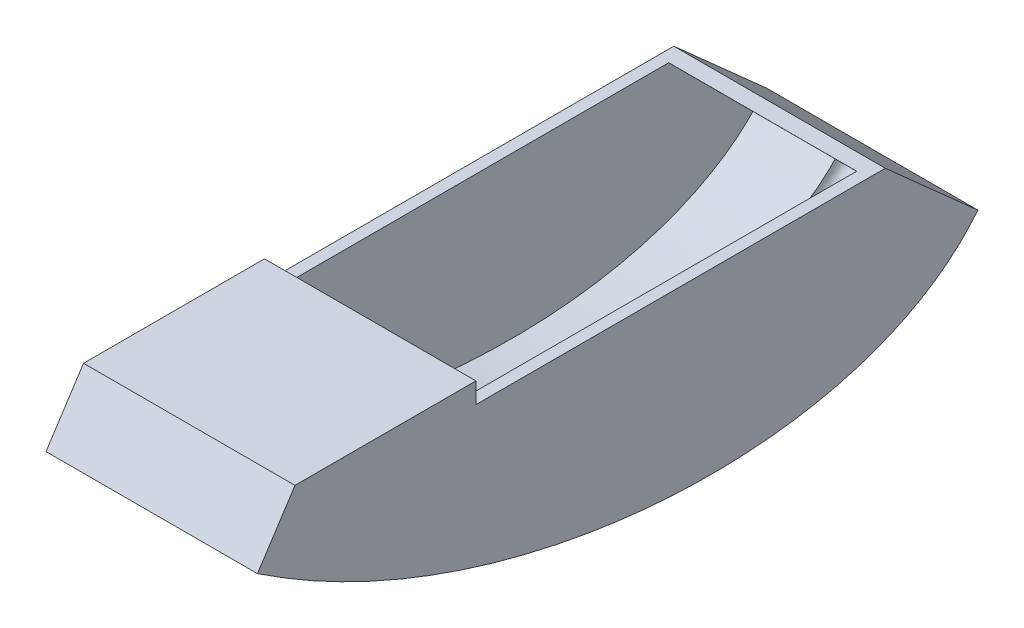
ISO-10303-21;
HEADER;
FILE_DESCRIPTION(('STEP AP214'),'2;1');
FILE_NAME('part.step','',(''),(''),'','','');
FILE_SCHEMA(('AUTOMOTIVE_DESIGN { 1 0 10303 214 1 1 1 1 }'));
ENDSEC;
DATA;
#1=APPLICATION_CONTEXT('core data for automotive mechanical design processes');
#2=APPLICATION_PROTOCOL_DEFINITION('international standard','automotive_design',2000,#1);
#3=PRODUCT_CONTEXT('',#1,'mechanical');
#4=PRODUCT('Part','Part','',(#3));
#5=PRODUCT_RELATED_PRODUCT_CATEGORY('part','',(#4));
#6=PRODUCT_DEFINITION_FORMATION('','',#4);
#7=PRODUCT_DEFINITION_CONTEXT('part definition',#1,'design');
#8=PRODUCT_DEFINITION('design','',#6,#7);
#9=PRODUCT_DEFINITION_SHAPE('','',#8);
#10=(LENGTH_UNIT() NAMED_UNIT(*) SI_UNIT(.MILLI.,.METRE.));
#11=(NAMED_UNIT(*) PLANE_ANGLE_UNIT() SI_UNIT($,.RADIAN.));
#12=(NAMED_UNIT(*) SI_UNIT($,.STERADIAN.) SOLID_ANGLE_UNIT());
#13=UNCERTAINTY_MEASURE_WITH_UNIT(LENGTH_MEASURE(1.E-05),#10,'distance_accuracy_value','');
#14=(GEOMETRIC_REPRESENTATION_CONTEXT(3) GLOBAL_UNCERTAINTY_ASSIGNED_CONTEXT((#13)) GLOBAL_UNIT_ASSIGNED_CONTEXT((#10,
#11,#12)) REPRESENTATION_CONTEXT('',''));
#15=CARTESIAN_POINT('',(0.,0.,0.));
#16=DIRECTION('',(0.,0.,1.));
#17=DIRECTION('',(1.,0.,0.));
#18=AXIS2_PLACEMENT_3D('',#15,#16,#17);
#19=CARTESIAN_POINT('',(-9.,-35.,0.));
#20=DIRECTION('',(0.,1.,0.));
#21=DIRECTION('',(0.,0.,1.));
#22=AXIS2_PLACEMENT_3D('',#19,#20,#21);
#23=PLANE('',#22);
#24=DIRECTION('',(0.,0.,-1.));
#25=VECTOR('',#24,1.);
#26=CARTESIAN_POINT('',(-16.,-35.,0.));
#27=LINE('',#26,#25);
#28=CARTESIAN_POINT('',(-16.,-35.,64.7209914306465));
#29=VERTEX_POINT('',#28);
#30=CARTESIAN_POINT('',(-16.,-35.,35.));
#31=VERTEX_POINT('',#30);
#32=EDGE_CURVE('E323',#29,#31,#27,.T.);
#33=ORIENTED_EDGE('',*,*,#32,.T.);
#34=DIRECTION('',(-1.,0.,0.));
#35=VECTOR('',#34,1.);
#36=CARTESIAN_POINT('',(-9.,-35.,35.));
#37=LINE('',#36,#35);
#38=CARTESIAN_POINT('',(16.,-35.,35.));
#39=VERTEX_POINT('',#38);
#40=EDGE_CURVE('E344',#39,#31,#37,.T.);
#41=ORIENTED_EDGE('',*,*,#40,.F.);
#42=DIRECTION('',(0.,0.,-1.));
#43=VECTOR('',#42,1.);
#44=CARTESIAN_POINT('',(16.,-35.,0.));
#45=LINE('',#44,#43);
#46=CARTESIAN_POINT('',(16.,-35.,64.7209914306465));
#47=VERTEX_POINT('',#46);
#48=EDGE_CURVE('E43',#47,#39,#45,.T.);
#49=ORIENTED_EDGE('',*,*,#48,.F.);
#50=DIRECTION('',(-1.,0.,0.));
#51=VECTOR('',#50,1.);
#52=CARTESIAN_POINT('',(-9.,-35.,64.7209914306465));
#53=LINE('',#52,#51);
#54=EDGE_CURVE('E305',#47,#29,#53,.T.);
#55=ORIENTED_EDGE('',*,*,#54,.T.);
#56=EDGE_LOOP('',(#33,#41,#49,#55));
#57=FACE_BOUND('',#56,.T.);
#58=ADVANCED_FACE('F39',(#57),#23,.F.);
#59=CARTESIAN_POINT('',(-9.,-19.3314120464027,-50.));
#60=DIRECTION('',(-1.,0.,0.));
#61=DIRECTION('',(0.,0.,1.));
#62=AXIS2_PLACEMENT_3D('',#59,#60,#61);
#63=CYLINDRICAL_SURFACE('',#62,25.);
#64=CARTESIAN_POINT('',(-16.,-19.3314120464027,-50.));
#65=DIRECTION('',(1.,0.,0.));
#66=DIRECTION('',(0.,0.,-1.));
#67=AXIS2_PLACEMENT_3D('',#64,#65,#66);
#68=CIRCLE('',#67,25.);
#69=CARTESIAN_POINT('',(-16.,-37.9942487774482,-33.3657424226286));
#70=VERTEX_POINT('',#69);
#71=CARTESIAN_POINT('',(-16.,-36.5012218389645,-31.828659056436));
#72=VERTEX_POINT('',#71);
#73=EDGE_CURVE('E321',#70,#72,#68,.F.);
#74=ORIENTED_EDGE('',*,*,#73,.F.);
#75=DIRECTION('',(-1.,0.,0.));
#76=VECTOR('',#75,1.);
#77=CARTESIAN_POINT('',(-9.,-37.9942487774482,-33.3657424226286));
#78=LINE('',#77,#76);
#79=CARTESIAN_POINT('',(16.,-37.9942487774482,-33.3657424226286));
#80=VERTEX_POINT('',#79);
#81=EDGE_CURVE('E318',#80,#70,#78,.T.);
#82=ORIENTED_EDGE('',*,*,#81,.F.);
#83=CARTESIAN_POINT('',(16.,-19.3314120464027,-50.));
#84=DIRECTION('',(1.,0.,0.));
#85=DIRECTION('',(0.,0.,-1.));
#86=AXIS2_PLACEMENT_3D('',#83,#84,#85);
#87=CIRCLE('',#86,25.);
#88=CARTESIAN_POINT('',(16.,-36.5012218389645,-31.828659056436));
#89=VERTEX_POINT('',#88);
#90=EDGE_CURVE('E325',#80,#89,#87,.F.);
#91=ORIENTED_EDGE('',*,*,#90,.T.);
#92=DIRECTION('',(-1.,0.,0.));
#93=VECTOR('',#92,1.);
#94=CARTESIAN_POINT('',(-9.,-36.5012218389645,-31.828659056436));
#95=LINE('',#94,#93);
#96=EDGE_CURVE('E99',#72,#89,#95,.F.);
#97=ORIENTED_EDGE('',*,*,#96,.F.);
#98=EDGE_LOOP('',(#74,#82,#91,#97));
#99=FACE_BOUND('',#98,.T.);
#100=ADVANCED_FACE('F41',(#99),#63,.T.);
#101=CARTESIAN_POINT('',(-16.,-48.7371623119089,-45.4187745688977));
#102=DIRECTION('',(1.,0.,0.));
#103=DIRECTION('',(0.,0.,-1.));
#104=AXIS2_PLACEMENT_3D('',#101,#102,#103);
#105=PLANE('',#104);
#106=DIRECTION('',(0.,0.,-1.));
#107=VECTOR('',#106,1.);
#108=CARTESIAN_POINT('',(-16.,-36.5012218389645,-45.4187745688977));
#109=LINE('',#108,#107);
#110=CARTESIAN_POINT('',(-16.,-36.5012218389645,35.));
#111=VERTEX_POINT('',#110);
#112=EDGE_CURVE('E417',#72,#111,#109,.F.);
#113=ORIENTED_EDGE('',*,*,#112,.T.);
#114=DIRECTION('',(0.,-1.,0.));
#115=VECTOR('',#114,1.);
#116=CARTESIAN_POINT('',(-16.,-48.7371623119092,34.9999999999999));
#117=LINE('',#116,#115);
#118=EDGE_CURVE('E89',#111,#31,#117,.F.);
#119=ORIENTED_EDGE('',*,*,#118,.T.);
#120=ORIENTED_EDGE('',*,*,#32,.F.);
#121=DIRECTION('',(0.,-0.838452772621463,0.544974263689012));
#122=VECTOR('',#121,1.);
#123=CARTESIAN_POINT('',(-16.,-39.7245368931714,67.7918274976293));
#124=LINE('',#123,#122);
#125=CARTESIAN_POINT('',(-16.,-41.4014424384143,68.8817760250073));
#126=VERTEX_POINT('',#125);
#127=EDGE_CURVE('E288',#29,#126,#124,.T.);
#128=ORIENTED_EDGE('',*,*,#127,.T.);
#129=CARTESIAN_POINT('',(-16.,-50.0679029180986,-46.9118015073813));
#130=CARTESIAN_POINT('',(-16.,-52.7594721746176,-44.5127955594893));
#131=CARTESIAN_POINT('',(-16.,-55.0306081242549,-41.5208673054452));
#132=CARTESIAN_POINT('',(-16.,-58.7801313824813,-34.6145473661733));
#133=CARTESIAN_POINT('',(-16.,-60.2599521903167,-30.6988687341364));
#134=CARTESIAN_POINT('',(-16.,-63.5749687861851,-17.8677454230769));
#135=CARTESIAN_POINT('',(-16.,-64.2909028498268,-7.86297639115742));
#136=CARTESIAN_POINT('',(-16.,-62.8066662150088,13.5188430697771));
#137=CARTESIAN_POINT('',(-16.,-60.6015112851942,24.8955807312422));
#138=CARTESIAN_POINT('',(-16.,-53.2352700502261,47.4444471127434));
#139=CARTESIAN_POINT('',(-16.,-48.0737268684886,58.6163456127337));
#140=CARTESIAN_POINT('',(-16.,-41.4014424384143,68.8817760250073));
#141=B_SPLINE_CURVE_WITH_KNOTS('',3,(#129,#130,#131,#132,#133,#134,#135,#136,#137,#138,#139,
#140),.UNSPECIFIED.,.F.,.F.,(4,2,2,2,2,4),(0.,0.125,0.25,0.5,0.75,1.),.UNSPECIFIED.);
#142=CARTESIAN_POINT('',(-16.,-50.0679029180986,-46.9118015073813));
#143=VERTEX_POINT('',#142);
#144=EDGE_CURVE('E272',#143,#126,#141,.T.);
#145=ORIENTED_EDGE('',*,*,#144,.F.);
#146=DIRECTION('',(0.,-0.665370303094855,-0.746513469241822));
#147=VECTOR('',#146,1.);
#148=CARTESIAN_POINT('',(-16.,-48.7371623119089,-45.4187745688977));
#149=LINE('',#148,#147);
#150=EDGE_CURVE('E284',#70,#143,#149,.T.);
#151=ORIENTED_EDGE('',*,*,#150,.F.);
#152=ORIENTED_EDGE('',*,*,#73,.T.);
#153=EDGE_LOOP('',(#113,#119,#120,#128,#145,#151,#152));
#154=FACE_BOUND('',#153,.T.);
#155=ADVANCED_FACE('F255',(#154),#105,.T.);
#156=CARTESIAN_POINT('',(16.,-50.0679029180986,-46.9118015073813));
#157=DIRECTION('',(1.,0.,0.));
#158=DIRECTION('',(0.,0.,-1.));
#159=AXIS2_PLACEMENT_3D('',#156,#157,#158);
#160=PLANE('',#159);
#161=DIRECTION('',(0.,0.,-1.));
#162=VECTOR('',#161,1.);
#163=CARTESIAN_POINT('',(16.,-36.5012218389645,-46.9118015073813));
#164=LINE('',#163,#162);
#165=CARTESIAN_POINT('',(16.,-36.5012218389645,35.));
#166=VERTEX_POINT('',#165);
#167=EDGE_CURVE('E414',#166,#89,#164,.T.);
#168=ORIENTED_EDGE('',*,*,#167,.T.);
#169=ORIENTED_EDGE('',*,*,#90,.F.);
#170=DIRECTION('',(0.,0.665370303094854,0.746513469241823));
#171=VECTOR('',#170,1.);
#172=CARTESIAN_POINT('',(16.,-50.0679029180986,-46.9118015073813));
#173=LINE('',#172,#171);
#174=CARTESIAN_POINT('',(16.,-50.0679029180986,-46.9118015073813));
#175=VERTEX_POINT('',#174);
#176=EDGE_CURVE('E373',#175,#80,#173,.T.);
#177=ORIENTED_EDGE('',*,*,#176,.F.);
#178=CARTESIAN_POINT('',(16.,-41.4014424384143,68.8817760250073));
#179=CARTESIAN_POINT('',(16.,-48.0737268684886,58.6163456127337));
#180=CARTESIAN_POINT('',(16.,-53.2352700502261,47.4444471127434));
#181=CARTESIAN_POINT('',(16.,-60.6015112851942,24.8955807312422));
#182=CARTESIAN_POINT('',(16.,-62.8066662150088,13.5188430697771));
#183=CARTESIAN_POINT('',(16.,-64.2909028498268,-7.86297639115742));
#184=CARTESIAN_POINT('',(16.,-63.5749687861851,-17.8677454230769));
#185=CARTESIAN_POINT('',(16.,-60.2599521903167,-30.6988687341364));
#186=CARTESIAN_POINT('',(16.,-58.7801313824813,-34.6145473661733));
#187=CARTESIAN_POINT('',(16.,-55.0306081242549,-41.5208673054452));
#188=CARTESIAN_POINT('',(16.,-52.7594721746176,-44.5127955594893));
#189=CARTESIAN_POINT('',(16.,-50.0679029180986,-46.9118015073813));
#190=B_SPLINE_CURVE_WITH_KNOTS('',3,(#178,#179,#180,#181,#182,#183,#184,#185,#186,#187,#188,
#189),.UNSPECIFIED.,.F.,.F.,(4,2,2,2,2,4),(0.,0.25,0.5,0.75,0.875,1.),.UNSPECIFIED.);
#191=CARTESIAN_POINT('',(16.,-41.4014424384143,68.8817760250073));
#192=VERTEX_POINT('',#191);
#193=EDGE_CURVE('E226',#175,#192,#190,.F.);
#194=ORIENTED_EDGE('',*,*,#193,.T.);
#195=DIRECTION('',(0.,0.838452772621465,-0.54497426368901));
#196=VECTOR('',#195,1.);
#197=CARTESIAN_POINT('',(16.,-41.4014424384143,68.8817760250073));
#198=LINE('',#197,#196);
#199=EDGE_CURVE('E339',#192,#47,#198,.T.);
#200=ORIENTED_EDGE('',*,*,#199,.T.);
#201=ORIENTED_EDGE('',*,*,#48,.T.);
#202=DIRECTION('',(0.,-1.,0.));
#203=VECTOR('',#202,1.);
#204=CARTESIAN_POINT('',(16.,-50.0679029180989,34.9999999999999));
#205=LINE('',#204,#203);
#206=EDGE_CURVE('E336',#39,#166,#205,.T.);
#207=ORIENTED_EDGE('',*,*,#206,.T.);
#208=EDGE_LOOP('',(#168,#169,#177,#194,#200,#201,#207));
#209=FACE_BOUND('',#208,.T.);
#210=ADVANCED_FACE('F188',(#209),#160,.F.);
#211=CARTESIAN_POINT('',(0.,-50.0679029180986,-46.9118015073813));
#212=DIRECTION('',(0.,-0.74651346924182,0.665370303094858));
#213=DIRECTION('',(0.,-0.665370303094858,-0.74651346924182));
#214=AXIS2_PLACEMENT_3D('',#211,#212,#213);
#215=PLANE('',#214);
#216=ORIENTED_EDGE('',*,*,#150,.T.);
#217=DIRECTION('',(1.,0.,0.));
#218=VECTOR('',#217,1.);
#219=CARTESIAN_POINT('',(-16.,-50.0679029180986,-46.9118015073813));
#220=LINE('',#219,#218);
#221=CARTESIAN_POINT('',(-2.,-50.0679029180986,-46.9118015073813));
#222=VERTEX_POINT('',#221);
#223=EDGE_CURVE('E296',#143,#222,#220,.T.);
#224=ORIENTED_EDGE('',*,*,#223,.T.);
#225=CARTESIAN_POINT('',(0.,-50.0679029180986,-46.9118015073813));
#226=DIRECTION('',(0.,-0.74651346924182,0.665370303094858));
#227=DIRECTION('',(0.,-0.665370303094858,-0.74651346924182));
#228=AXIS2_PLACEMENT_3D('',#225,#226,#227);
#229=CIRCLE('',#228,2.);
#230=CARTESIAN_POINT('',(2.,-50.0679029180986,-46.9118015073813));
#231=VERTEX_POINT('',#230);
#232=EDGE_CURVE('E301',#222,#231,#229,.T.);
#233=ORIENTED_EDGE('',*,*,#232,.T.);
#234=DIRECTION('',(1.,0.,0.));
#235=VECTOR('',#234,1.);
#236=CARTESIAN_POINT('',(2.,-50.0679029180986,-46.9118015073813));
#237=LINE('',#236,#235);
#238=EDGE_CURVE('E303',#231,#175,#237,.T.);
#239=ORIENTED_EDGE('',*,*,#238,.T.);
#240=ORIENTED_EDGE('',*,*,#176,.T.);
#241=ORIENTED_EDGE('',*,*,#81,.T.);
#242=EDGE_LOOP('',(#216,#224,#233,#239,#240,#241));
#243=FACE_BOUND('',#242,.T.);
#244=ADVANCED_FACE('F184',(#243),#215,.T.);
#245=CARTESIAN_POINT('',(0.,-41.4014424384143,68.8817760250073));
#246=DIRECTION('',(0.,0.544974263689015,0.838452772621462));
#247=DIRECTION('',(0.,-0.838452772621462,0.544974263689015));
#248=AXIS2_PLACEMENT_3D('',#245,#246,#247);
#249=PLANE('',#248);
#250=ORIENTED_EDGE('',*,*,#127,.F.);
#251=ORIENTED_EDGE('',*,*,#54,.F.);
#252=ORIENTED_EDGE('',*,*,#199,.F.);
#253=DIRECTION('',(1.,0.,0.));
#254=VECTOR('',#253,1.);
#255=CARTESIAN_POINT('',(2.,-41.4014424384143,68.8817760250073));
#256=LINE('',#255,#254);
#257=CARTESIAN_POINT('',(2.,-41.4014424384143,68.8817760250073));
#258=VERTEX_POINT('',#257);
#259=EDGE_CURVE('E365',#258,#192,#256,.T.);
#260=ORIENTED_EDGE('',*,*,#259,.F.);
#261=CARTESIAN_POINT('',(0.,-41.4014424384143,68.8817760250073));
#262=DIRECTION('',(0.,0.544974263689015,0.838452772621462));
#263=DIRECTION('',(0.,-0.838452772621462,0.544974263689015));
#264=AXIS2_PLACEMENT_3D('',#261,#262,#263);
#265=CIRCLE('',#264,2.);
#266=CARTESIAN_POINT('',(-2.,-41.4014424384143,68.8817760250073));
#267=VERTEX_POINT('',#266);
#268=EDGE_CURVE('E388',#267,#258,#265,.T.);
#269=ORIENTED_EDGE('',*,*,#268,.F.);
#270=DIRECTION('',(1.,0.,0.));
#271=VECTOR('',#270,1.);
#272=CARTESIAN_POINT('',(-16.,-41.4014424384143,68.8817760250073));
#273=LINE('',#272,#271);
#274=EDGE_CURVE('E293',#126,#267,#273,.T.);
#275=ORIENTED_EDGE('',*,*,#274,.F.);
#276=EDGE_LOOP('',(#250,#251,#252,#260,#269,#275));
#277=FACE_BOUND('',#276,.T.);
#278=ADVANCED_FACE('F187',(#277),#249,.F.);
#279=CARTESIAN_POINT('',(2.,-50.0679029180986,-46.9118015073813));
#280=CARTESIAN_POINT('',(2.,-52.7594721746176,-44.5127955594893));
#281=CARTESIAN_POINT('',(2.,-55.0306081242549,-41.5208673054452));
#282=CARTESIAN_POINT('',(2.,-58.7801313824813,-34.6145473661733));
#283=CARTESIAN_POINT('',(2.,-60.2599521903167,-30.6988687341364));
#284=CARTESIAN_POINT('',(2.,-63.5749687861851,-17.8677454230769));
#285=CARTESIAN_POINT('',(2.,-64.2909028498268,-7.86297639115742));
#286=CARTESIAN_POINT('',(2.,-62.8066662150088,13.5188430697771));
#287=CARTESIAN_POINT('',(2.,-60.6015112851942,24.8955807312422));
#288=CARTESIAN_POINT('',(2.,-53.2352700502261,47.4444471127434));
#289=CARTESIAN_POINT('',(2.,-48.0737268684886,58.6163456127337));
#290=CARTESIAN_POINT('',(2.,-41.4014424384143,68.8817760250073));
#291=CARTESIAN_POINT('',(16.,-50.0679029180986,-46.9118015073813));
#292=CARTESIAN_POINT('',(16.,-52.7594721746176,-44.5127955594893));
#293=CARTESIAN_POINT('',(16.,-55.0306081242549,-41.5208673054452));
#294=CARTESIAN_POINT('',(16.,-58.7801313824813,-34.6145473661733));
#295=CARTESIAN_POINT('',(16.,-60.2599521903167,-30.6988687341364));
#296=CARTESIAN_POINT('',(16.,-63.5749687861851,-17.8677454230769));
#297=CARTESIAN_POINT('',(16.,-64.2909028498268,-7.86297639115742));
#298=CARTESIAN_POINT('',(16.,-62.8066662150088,13.5188430697771));
#299=CARTESIAN_POINT('',(16.,-60.6015112851942,24.8955807312422));
#300=CARTESIAN_POINT('',(16.,-53.2352700502261,47.4444471127434));
#301=CARTESIAN_POINT('',(16.,-48.0737268684886,58.6163456127337));
#302=CARTESIAN_POINT('',(16.,-41.4014424384143,68.8817760250073));
#303=B_SPLINE_SURFACE_WITH_KNOTS('',1,3,((#279,#280,#281,#282,#283,#284,#285,#286,#287,#288,
#289,#290),(#291,#292,#293,#294,#295,#296,#297,#298,#299,#300,#301,#302)),.UNSPECIFIED.,.F.,.F.,
.F.,(2,2),(4,2,2,2,2,4),(0.,1.),(0.,0.125,0.25,0.5,0.75,1.),.UNSPECIFIED.);
#304=CARTESIAN_POINT('',(2.,-50.0679029180986,-46.9118015073813));
#305=CARTESIAN_POINT('',(2.,-52.7594721746176,-44.5127955594893));
#306=CARTESIAN_POINT('',(2.,-55.0306081242549,-41.5208673054452));
#307=CARTESIAN_POINT('',(2.,-58.7801313824813,-34.6145473661733));
#308=CARTESIAN_POINT('',(2.,-60.2599521903167,-30.6988687341364));
#309=CARTESIAN_POINT('',(2.,-63.5749687861851,-17.8677454230769));
#310=CARTESIAN_POINT('',(2.,-64.2909028498268,-7.86297639115742));
#311=CARTESIAN_POINT('',(2.,-62.8066662150088,13.5188430697771));
#312=CARTESIAN_POINT('',(2.,-60.6015112851942,24.8955807312422));
#313=CARTESIAN_POINT('',(2.,-53.2352700502261,47.4444471127434));
#314=CARTESIAN_POINT('',(2.,-48.0737268684886,58.6163456127337));
#315=CARTESIAN_POINT('',(2.,-41.4014424384143,68.8817760250073));
#316=(BOUNDED_CURVE() B_SPLINE_CURVE(3,(#304,#305,#306,#307,#308,#309,#310,#311,#312,#313,#314,
#315),.UNSPECIFIED.,.F.,.F.) B_SPLINE_CURVE_WITH_KNOTS((4,2,2,2,2,4),(0.,0.125,0.25,0.5,0.75,
1.),.UNSPECIFIED.) CURVE() GEOMETRIC_REPRESENTATION_ITEM() RATIONAL_B_SPLINE_CURVE((1.,1.,1.,1.,
1.,1.,1.,1.,1.,1.,1.,1.)) REPRESENTATION_ITEM(''));
#317=EDGE_CURVE('E370',#231,#258,#316,.T.);
#318=ORIENTED_EDGE('',*,*,#193,.F.);
#319=ORIENTED_EDGE('',*,*,#238,.F.);
#320=ORIENTED_EDGE('',*,*,#317,.T.);
#321=ORIENTED_EDGE('',*,*,#259,.T.);
#322=EDGE_LOOP('',(#318,#319,#320,#321));
#323=FACE_BOUND('',#322,.T.);
#324=ADVANCED_FACE('F192',(#323),#303,.F.);
#325=CARTESIAN_POINT('',(-16.,-50.0679029180986,-46.9118015073813));
#326=CARTESIAN_POINT('',(-16.,-52.7594721746176,-44.5127955594893));
#327=CARTESIAN_POINT('',(-16.,-55.0306081242549,-41.5208673054452));
#328=CARTESIAN_POINT('',(-16.,-58.7801313824813,-34.6145473661733));
#329=CARTESIAN_POINT('',(-16.,-60.2599521903167,-30.6988687341364));
#330=CARTESIAN_POINT('',(-16.,-63.5749687861851,-17.8677454230769));
#331=CARTESIAN_POINT('',(-16.,-64.2909028498268,-7.86297639115742));
#332=CARTESIAN_POINT('',(-16.,-62.8066662150088,13.5188430697771));
#333=CARTESIAN_POINT('',(-16.,-60.6015112851942,24.8955807312422));
#334=CARTESIAN_POINT('',(-16.,-53.2352700502261,47.4444471127434));
#335=CARTESIAN_POINT('',(-16.,-48.0737268684886,58.6163456127337));
#336=CARTESIAN_POINT('',(-16.,-41.4014424384143,68.8817760250073));
#337=CARTESIAN_POINT('',(-2.,-50.0679029180986,-46.9118015073813));
#338=CARTESIAN_POINT('',(-2.,-52.7594721746176,-44.5127955594893));
#339=CARTESIAN_POINT('',(-2.,-55.0306081242549,-41.5208673054452));
#340=CARTESIAN_POINT('',(-2.,-58.7801313824813,-34.6145473661733));
#341=CARTESIAN_POINT('',(-2.,-60.2599521903167,-30.6988687341364));
#342=CARTESIAN_POINT('',(-2.,-63.5749687861851,-17.8677454230769));
#343=CARTESIAN_POINT('',(-2.,-64.2909028498268,-7.86297639115742));
#344=CARTESIAN_POINT('',(-2.,-62.8066662150088,13.5188430697771));
#345=CARTESIAN_POINT('',(-2.,-60.6015112851942,24.8955807312422));
#346=CARTESIAN_POINT('',(-2.,-53.2352700502261,47.4444471127434));
#347=CARTESIAN_POINT('',(-2.,-48.0737268684886,58.6163456127337));
#348=CARTESIAN_POINT('',(-2.,-41.4014424384143,68.8817760250073));
#349=B_SPLINE_SURFACE_WITH_KNOTS('',1,3,((#325,#326,#327,#328,#329,#330,#331,#332,#333,#334,
#335,#336),(#337,#338,#339,#340,#341,#342,#343,#344,#345,#346,#347,#348)),.UNSPECIFIED.,.F.,.F.,
.F.,(2,2),(4,2,2,2,2,4),(0.,1.),(0.,0.125,0.25,0.5,0.75,1.),.UNSPECIFIED.);
#350=CARTESIAN_POINT('',(-2.,-50.0679029180986,-46.9118015073813));
#351=CARTESIAN_POINT('',(-2.,-52.7594721746176,-44.5127955594893));
#352=CARTESIAN_POINT('',(-2.,-55.0306081242549,-41.5208673054452));
#353=CARTESIAN_POINT('',(-2.,-58.7801313824813,-34.6145473661733));
#354=CARTESIAN_POINT('',(-2.,-60.2599521903167,-30.6988687341364));
#355=CARTESIAN_POINT('',(-2.,-63.5749687861851,-17.8677454230769));
#356=CARTESIAN_POINT('',(-2.,-64.2909028498268,-7.86297639115742));
#357=CARTESIAN_POINT('',(-2.,-62.8066662150088,13.5188430697771));
#358=CARTESIAN_POINT('',(-2.,-60.6015112851942,24.8955807312422));
#359=CARTESIAN_POINT('',(-2.,-53.2352700502261,47.4444471127434));
#360=CARTESIAN_POINT('',(-2.,-48.0737268684886,58.6163456127337));
#361=CARTESIAN_POINT('',(-2.,-41.4014424384143,68.8817760250073));
#362=B_SPLINE_CURVE_WITH_KNOTS('',3,(#350,#351,#352,#353,#354,#355,#356,#357,#358,#359,#360,
#361),.UNSPECIFIED.,.F.,.F.,(4,2,2,2,2,4),(0.,0.125,0.25,0.5,0.75,1.),.UNSPECIFIED.);
#363=EDGE_CURVE('E298',#222,#267,#362,.T.);
#364=ORIENTED_EDGE('',*,*,#363,.F.);
#365=ORIENTED_EDGE('',*,*,#223,.F.);
#366=ORIENTED_EDGE('',*,*,#144,.T.);
#367=ORIENTED_EDGE('',*,*,#274,.T.);
#368=EDGE_LOOP('',(#364,#365,#366,#367));
#369=FACE_BOUND('',#368,.T.);
#370=ADVANCED_FACE('F199',(#369),#349,.F.);
#371=CARTESIAN_POINT('',(-2.,-50.0679029180986,-46.9118015073813));
#372=CARTESIAN_POINT('',(-2.,-52.7594721746176,-44.5127955594893));
#373=CARTESIAN_POINT('',(-2.,-55.0306081242549,-41.5208673054452));
#374=CARTESIAN_POINT('',(-2.,-58.7801313824813,-34.6145473661733));
#375=CARTESIAN_POINT('',(-2.,-60.2599521903167,-30.6988687341364));
#376=CARTESIAN_POINT('',(-2.,-63.5749687861851,-17.8677454230769));
#377=CARTESIAN_POINT('',(-2.,-64.2909028498268,-7.86297639115742));
#378=CARTESIAN_POINT('',(-2.,-62.8066662150088,13.5188430697771));
#379=CARTESIAN_POINT('',(-2.,-60.6015112851942,24.8955807312422));
#380=CARTESIAN_POINT('',(-2.,-53.2352700502261,47.4444471127434));
#381=CARTESIAN_POINT('',(-2.,-48.0737268684886,58.6163456127337));
#382=CARTESIAN_POINT('',(-2.,-41.4014424384143,68.8817760250073));
#383=CARTESIAN_POINT('',(-2.,-52.729384130478,-49.8978553843486));
#384=CARTESIAN_POINT('',(-2.,-55.8231365587786,-47.14038204041));
#385=CARTESIAN_POINT('',(-2.,-58.3615305169903,-43.7690529465912));
#386=CARTESIAN_POINT('',(-2.,-62.4798750270147,-36.1833939586343));
#387=CARTESIAN_POINT('',(-2.,-64.0641260758127,-31.965203225916));
#388=CARTESIAN_POINT('',(-2.,-67.5851249268749,-18.3368037512888));
#389=CARTESIAN_POINT('',(-2.,-68.3056707435307,-7.93705692740055));
#390=CARTESIAN_POINT('',(-2.,-66.7726934712865,14.1469170843479));
#391=CARTESIAN_POINT('',(-2.,-64.5042176881784,25.830205965516));
#392=CARTESIAN_POINT('',(-2.,-56.9370742581048,48.9940558387224));
#393=CARTESIAN_POINT('',(-2.,-51.6370359810741,60.4739261670237));
#394=CARTESIAN_POINT('',(-2.,-44.7552535289001,71.0616730797634));
#395=CARTESIAN_POINT('',(2.,-52.729384130478,-49.8978553843486));
#396=CARTESIAN_POINT('',(2.,-55.8231365587786,-47.14038204041));
#397=CARTESIAN_POINT('',(2.,-58.3615305169903,-43.7690529465912));
#398=CARTESIAN_POINT('',(2.,-62.4798750270147,-36.1833939586343));
#399=CARTESIAN_POINT('',(2.,-64.0641260758127,-31.965203225916));
#400=CARTESIAN_POINT('',(2.,-67.5851249268749,-18.3368037512888));
#401=CARTESIAN_POINT('',(2.,-68.3056707435307,-7.93705692740055));
#402=CARTESIAN_POINT('',(2.,-66.7726934712865,14.1469170843479));
#403=CARTESIAN_POINT('',(2.,-64.5042176881784,25.830205965516));
#404=CARTESIAN_POINT('',(2.,-56.9370742581048,48.9940558387224));
#405=CARTESIAN_POINT('',(2.,-51.6370359810741,60.4739261670237));
#406=CARTESIAN_POINT('',(2.,-44.7552535289001,71.0616730797634));
#407=CARTESIAN_POINT('',(2.,-50.0679029180986,-46.9118015073813));
#408=CARTESIAN_POINT('',(2.,-52.7594721746176,-44.5127955594893));
#409=CARTESIAN_POINT('',(2.,-55.0306081242549,-41.5208673054452));
#410=CARTESIAN_POINT('',(2.,-58.7801313824813,-34.6145473661733));
#411=CARTESIAN_POINT('',(2.,-60.2599521903167,-30.6988687341364));
#412=CARTESIAN_POINT('',(2.,-63.5749687861851,-17.8677454230769));
#413=CARTESIAN_POINT('',(2.,-64.2909028498268,-7.86297639115742));
#414=CARTESIAN_POINT('',(2.,-62.8066662150088,13.5188430697771));
#415=CARTESIAN_POINT('',(2.,-60.6015112851942,24.8955807312422));
#416=CARTESIAN_POINT('',(2.,-53.2352700502261,47.4444471127434));
#417=CARTESIAN_POINT('',(2.,-48.0737268684886,58.6163456127337));
#418=CARTESIAN_POINT('',(2.,-41.4014424384143,68.8817760250073));
#419=(BOUNDED_SURFACE() B_SPLINE_SURFACE(3,3,((#371,#372,#373,#374,#375,#376,#377,#378,#379,
#380,#381,#382),(#383,#384,#385,#386,#387,#388,#389,#390,#391,#392,#393,#394),(#395,#396,#397,
#398,#399,#400,#401,#402,#403,#404,#405,#406),(#407,#408,#409,#410,#411,#412,#413,#414,#415,
#416,#417,#418)),.UNSPECIFIED.,.F.,.F.,.F.) B_SPLINE_SURFACE_WITH_KNOTS((4,4),(4,2,2,2,2,4),(0.,
1.),(0.,0.125,0.25,0.5,0.75,1.),
.UNSPECIFIED.) GEOMETRIC_REPRESENTATION_ITEM() RATIONAL_B_SPLINE_SURFACE(((1.,1.,1.,1.,1.,1.,1.,
1.,1.,1.,1.,1.),(0.333333333333333,0.333333333333333,0.333333333333333,0.333333333333333,
0.333333333333333,0.333333333333333,0.333333333333333,0.333333333333333,0.333333333333333,
0.333333333333333,0.333333333333333,0.333333333333333),(0.333333333333333,0.333333333333333,
0.333333333333333,0.333333333333333,0.333333333333333,0.333333333333333,0.333333333333333,
0.333333333333333,0.333333333333333,0.333333333333333,0.333333333333333,0.333333333333333),(1.,
1.,1.,1.,1.,1.,1.,1.,1.,1.,1.,1.))) REPRESENTATION_ITEM('') SURFACE());
#420=ORIENTED_EDGE('',*,*,#317,.F.);
#421=ORIENTED_EDGE('',*,*,#232,.F.);
#422=ORIENTED_EDGE('',*,*,#363,.T.);
#423=ORIENTED_EDGE('',*,*,#268,.T.);
#424=EDGE_LOOP('',(#420,#421,#422,#423));
#425=FACE_BOUND('',#424,.T.);
#426=ADVANCED_FACE('F169',(#425),#419,.F.);
#427=CARTESIAN_POINT('',(18.,-42.8268522289006,72.1936043613172));
#428=CARTESIAN_POINT('',(18.,-43.2557600418929,71.5337219247264));
#429=CARTESIAN_POINT('',(18.,-44.1052836947944,70.2367414340145));
#430=CARTESIAN_POINT('',(18.,-45.8673203175257,67.4583307716444));
#431=CARTESIAN_POINT('',(18.,-48.7587932581704,62.5936698574761));
#432=CARTESIAN_POINT('',(18.,-52.5251586979627,55.4208917710102));
#433=CARTESIAN_POINT('',(18.,-56.4113352929365,46.6170486633399));
#434=CARTESIAN_POINT('',(18.,-60.775628402668,34.6998176577238));
#435=CARTESIAN_POINT('',(18.,-64.7028397405151,19.6873210429305));
#436=CARTESIAN_POINT('',(18.,-66.9934926757415,2.12397905459888));
#437=CARTESIAN_POINT('',(18.,-66.8859778976843,-11.6125861914613));
#438=CARTESIAN_POINT('',(18.,-65.5643872759321,-21.766099042637));
#439=CARTESIAN_POINT('',(18.,-63.93728287803,-28.8917332558043));
#440=CARTESIAN_POINT('',(18.,-62.031787567841,-34.3622722883523));
#441=CARTESIAN_POINT('',(18.,-60.1547922144173,-38.4181548263212));
#442=CARTESIAN_POINT('',(18.,-58.5653681271417,-41.2862759611761));
#443=CARTESIAN_POINT('',(18.,-56.7849290939593,-43.9703038636018));
#444=CARTESIAN_POINT('',(18.,-55.1406205681165,-46.0349965018227));
#445=CARTESIAN_POINT('',(18.,-53.7160860453543,-47.5810622043109));
#446=CARTESIAN_POINT('',(18.,-52.8005167654389,-48.4855849913809));
#447=CARTESIAN_POINT('',(18.,-52.0026391722468,-49.2077692766467));
#448=CARTESIAN_POINT('',(18.,-51.393630306871,-49.7478229660989));
#449=CARTESIAN_POINT('',(18.,-50.8943781942802,-50.1938426170682));
#450=CARTESIAN_POINT('',(18.,-50.5709868888994,-50.4820825212965));
#451=B_SPLINE_CURVE_WITH_KNOTS('',3,(#427,#428,#429,#430,#431,#432,#433,#434,#435,#436,#437,
#438,#439,#440,#441,#442,#443,#444,#445,#446,#447,#448,#449,#450),.UNSPECIFIED.,.F.,.F.,(4,1,1,
1,1,1,1,1,1,1,1,1,1,1,1,1,1,1,1,1,1,4),(0.,0.015625,0.03125,0.0625,0.125,0.1875,0.25,0.375,0.5,
0.625,0.6875,0.75,0.8125,0.84375,0.875,0.90625,0.9375,0.953125,0.96875,0.9765625,0.984375,1.),.UNSPECIFIED.);
#452=DIRECTION('',(-1.,0.,0.));
#453=VECTOR('',#452,1.);
#454=SURFACE_OF_LINEAR_EXTRUSION('',#451,#453);
#455=CARTESIAN_POINT('',(-18.,-42.8268522289006,72.1936043613172));
#456=CARTESIAN_POINT('',(-18.,-43.2557600418929,71.5337219247264));
#457=CARTESIAN_POINT('',(-18.,-44.1052836947944,70.2367414340145));
#458=CARTESIAN_POINT('',(-18.,-45.8673203175257,67.4583307716444));
#459=CARTESIAN_POINT('',(-18.,-48.7587932581704,62.5936698574761));
#460=CARTESIAN_POINT('',(-18.,-52.5251586979627,55.4208917710102));
#461=CARTESIAN_POINT('',(-18.,-56.4113352929365,46.6170486633399));
#462=CARTESIAN_POINT('',(-18.,-60.775628402668,34.6998176577238));
#463=CARTESIAN_POINT('',(-18.,-64.7028397405151,19.6873210429305));
#464=CARTESIAN_POINT('',(-18.,-66.9934926757415,2.12397905459888));
#465=CARTESIAN_POINT('',(-18.,-66.8859778976843,-11.6125861914613));
#466=CARTESIAN_POINT('',(-18.,-65.5643872759321,-21.766099042637));
#467=CARTESIAN_POINT('',(-18.,-63.93728287803,-28.8917332558043));
#468=CARTESIAN_POINT('',(-18.,-62.031787567841,-34.3622722883523));
#469=CARTESIAN_POINT('',(-18.,-60.1547922144173,-38.4181548263212));
#470=CARTESIAN_POINT('',(-18.,-58.5653681271417,-41.2862759611761));
#471=CARTESIAN_POINT('',(-18.,-56.7849290939593,-43.9703038636018));
#472=CARTESIAN_POINT('',(-18.,-55.1406205681165,-46.0349965018227));
#473=CARTESIAN_POINT('',(-18.,-53.7160860453543,-47.5810622043109));
#474=CARTESIAN_POINT('',(-18.,-52.8005167654389,-48.4855849913809));
#475=CARTESIAN_POINT('',(-18.,-52.0026391722468,-49.2077692766467));
#476=CARTESIAN_POINT('',(-18.,-51.393630306871,-49.7478229660989));
#477=CARTESIAN_POINT('',(-18.,-50.8943781942802,-50.1938426170682));
#478=CARTESIAN_POINT('',(-18.,-50.5709868888994,-50.4820825212965));
#479=B_SPLINE_CURVE_WITH_KNOTS('',3,(#455,#456,#457,#458,#459,#460,#461,#462,#463,#464,#465,
#466,#467,#468,#469,#470,#471,#472,#473,#474,#475,#476,#477,#478),.UNSPECIFIED.,.F.,.F.,(4,1,1,
1,1,1,1,1,1,1,1,1,1,1,1,1,1,1,1,1,1,4),(0.,0.015625,0.03125,0.0625,0.125,0.1875,0.25,0.375,0.5,
0.625,0.6875,0.75,0.8125,0.84375,0.875,0.90625,0.9375,0.953125,0.96875,0.9765625,0.984375,1.),.UNSPECIFIED.);
#480=CARTESIAN_POINT('',(-18.,-42.8268522289006,72.1936043613172));
#481=VERTEX_POINT('',#480);
#482=CARTESIAN_POINT('',(-18.,-50.5709868888994,-50.4820825212965));
#483=VERTEX_POINT('',#482);
#484=EDGE_CURVE('E49',#481,#483,#479,.T.);
#485=ORIENTED_EDGE('',*,*,#484,.T.);
#486=DIRECTION('',(-1.,0.,0.));
#487=VECTOR('',#486,1.);
#488=CARTESIAN_POINT('',(18.,-50.5709868888994,-50.4820825212965));
#489=LINE('',#488,#487);
#490=CARTESIAN_POINT('',(18.,-50.5709868888994,-50.4820825212965));
#491=VERTEX_POINT('',#490);
#492=EDGE_CURVE('E127',#491,#483,#489,.T.);
#493=ORIENTED_EDGE('',*,*,#492,.F.);
#494=CARTESIAN_POINT('',(18.,-42.8268522289006,72.1936043613172));
#495=VERTEX_POINT('',#494);
#496=EDGE_CURVE('E153',#495,#491,#451,.T.);
#497=ORIENTED_EDGE('',*,*,#496,.F.);
#498=DIRECTION('',(-1.,0.,0.));
#499=VECTOR('',#498,1.);
#500=CARTESIAN_POINT('',(18.,-42.8268522289006,72.1936043613172));
#501=LINE('',#500,#499);
#502=EDGE_CURVE('E409',#495,#481,#501,.T.);
#503=ORIENTED_EDGE('',*,*,#502,.T.);
#504=EDGE_LOOP('',(#485,#493,#497,#503));
#505=FACE_BOUND('',#504,.T.);
#506=ADVANCED_FACE('F164',(#505),#454,.F.);
#507=CARTESIAN_POINT('',(18.,20.2683533687623,31.1832286601483));
#508=DIRECTION('',(0.,-0.54497426368901,-0.838452772621464));
#509=DIRECTION('',(0.,0.838452772621465,-0.54497426368901));
#510=AXIS2_PLACEMENT_3D('',#507,#508,#509);
#511=PLANE('',#510);
#512=DIRECTION('',(0.,-0.838452772621465,0.54497426368901));
#513=VECTOR('',#512,1.);
#514=CARTESIAN_POINT('',(-18.,20.2683533687623,31.1832286601483));
#515=LINE('',#514,#513);
#516=CARTESIAN_POINT('',(-18.,-33.,65.8063852683658));
#517=VERTEX_POINT('',#516);
#518=EDGE_CURVE('E11',#517,#481,#515,.T.);
#519=ORIENTED_EDGE('',*,*,#518,.T.);
#520=ORIENTED_EDGE('',*,*,#502,.F.);
#521=DIRECTION('',(0.,-0.838452772621465,0.54497426368901));
#522=VECTOR('',#521,1.);
#523=CARTESIAN_POINT('',(18.,20.2683533687623,31.1832286601483));
#524=LINE('',#523,#522);
#525=CARTESIAN_POINT('',(18.,-33.,65.8063852683658));
#526=VERTEX_POINT('',#525);
#527=EDGE_CURVE('E158',#526,#495,#524,.T.);
#528=ORIENTED_EDGE('',*,*,#527,.F.);
#529=DIRECTION('',(-1.,0.,0.));
#530=VECTOR('',#529,1.);
#531=CARTESIAN_POINT('',(18.,-33.,65.8063852683658));
#532=LINE('',#531,#530);
#533=EDGE_CURVE('E148',#526,#517,#532,.T.);
#534=ORIENTED_EDGE('',*,*,#533,.T.);
#535=EDGE_LOOP('',(#519,#520,#528,#534));
#536=FACE_BOUND('',#535,.T.);
#537=ADVANCED_FACE('F168',(#536),#511,.F.);
#538=CARTESIAN_POINT('',(18.,-33.,0.));
#539=DIRECTION('',(0.,-1.,0.));
#540=DIRECTION('',(0.,0.,-1.));
#541=AXIS2_PLACEMENT_3D('',#538,#539,#540);
#542=PLANE('',#541);
#543=DIRECTION('',(0.,0.,1.));
#544=VECTOR('',#543,1.);
#545=CARTESIAN_POINT('',(-18.,-33.,0.));
#546=LINE('',#545,#544);
#547=CARTESIAN_POINT('',(-18.,-33.,35.));
#548=VERTEX_POINT('',#547);
#549=EDGE_CURVE('E431',#548,#517,#546,.T.);
#550=ORIENTED_EDGE('',*,*,#549,.T.);
#551=ORIENTED_EDGE('',*,*,#533,.F.);
#552=DIRECTION('',(0.,0.,1.));
#553=VECTOR('',#552,1.);
#554=CARTESIAN_POINT('',(18.,-33.,0.));
#555=LINE('',#554,#553);
#556=CARTESIAN_POINT('',(18.,-33.,35.));
#557=VERTEX_POINT('',#556);
#558=EDGE_CURVE('E145',#557,#526,#555,.T.);
#559=ORIENTED_EDGE('',*,*,#558,.F.);
#560=DIRECTION('',(-1.,0.,0.));
#561=VECTOR('',#560,1.);
#562=CARTESIAN_POINT('',(18.,-33.,35.));
#563=LINE('',#562,#561);
#564=EDGE_CURVE('E423',#557,#548,#563,.T.);
#565=ORIENTED_EDGE('',*,*,#564,.T.);
#566=EDGE_LOOP('',(#550,#551,#559,#565));
#567=FACE_BOUND('',#566,.T.);
#568=ADVANCED_FACE('F174',(#567),#542,.F.);
#569=CARTESIAN_POINT('',(-18.,0.,0.));
#570=DIRECTION('',(1.,0.,0.));
#571=DIRECTION('',(0.,0.,-1.));
#572=AXIS2_PLACEMENT_3D('',#569,#570,#571);
#573=PLANE('',#572);
#574=ORIENTED_EDGE('',*,*,#518,.F.);
#575=ORIENTED_EDGE('',*,*,#549,.F.);
#576=DIRECTION('',(0.,1.,0.));
#577=VECTOR('',#576,1.);
#578=CARTESIAN_POINT('',(-18.,-1.38729448065238E-13,35.0000000000001));
#579=LINE('',#578,#577);
#580=CARTESIAN_POINT('',(-18.,-36.5012218389645,35.));
#581=VERTEX_POINT('',#580);
#582=EDGE_CURVE('E132',#581,#548,#579,.T.);
#583=ORIENTED_EDGE('',*,*,#582,.F.);
#584=DIRECTION('',(0.,0.,1.));
#585=VECTOR('',#584,1.);
#586=CARTESIAN_POINT('',(-18.,-36.5012218389645,0.));
#587=LINE('',#586,#585);
#588=CARTESIAN_POINT('',(-18.,-36.5012218389645,-34.6964830288183));
#589=VERTEX_POINT('',#588);
#590=EDGE_CURVE('E118',#589,#581,#587,.T.);
#591=ORIENTED_EDGE('',*,*,#590,.F.);
#592=DIRECTION('',(0.,-0.665370303094834,-0.746513469241841));
#593=VECTOR('',#592,1.);
#594=CARTESIAN_POINT('',(-18.,-3.10747005057408,2.76969991111944));
#595=LINE('',#594,#593);
#596=EDGE_CURVE('E130',#589,#483,#595,.T.);
#597=ORIENTED_EDGE('',*,*,#596,.T.);
#598=ORIENTED_EDGE('',*,*,#484,.F.);
#599=EDGE_LOOP('',(#574,#575,#583,#591,#597,#598));
#600=FACE_BOUND('',#599,.T.);
#601=ADVANCED_FACE('F129',(#600),#573,.F.);
#602=CARTESIAN_POINT('',(18.,-3.10747005057408,2.76969991111944));
#603=DIRECTION('',(0.,0.746513469241841,-0.665370303094834));
#604=DIRECTION('',(0.,0.665370303094834,0.746513469241841));
#605=AXIS2_PLACEMENT_3D('',#602,#603,#604);
#606=PLANE('',#605);
#607=ORIENTED_EDGE('',*,*,#596,.F.);
#608=DIRECTION('',(-1.,0.,0.));
#609=VECTOR('',#608,1.);
#610=CARTESIAN_POINT('',(18.,-36.5012218389645,-34.6964830288183));
#611=LINE('',#610,#609);
#612=CARTESIAN_POINT('',(18.,-36.5012218389645,-34.6964830288183));
#613=VERTEX_POINT('',#612);
#614=EDGE_CURVE('E114',#613,#589,#611,.T.);
#615=ORIENTED_EDGE('',*,*,#614,.F.);
#616=DIRECTION('',(0.,-0.665370303094834,-0.746513469241841));
#617=VECTOR('',#616,1.);
#618=CARTESIAN_POINT('',(18.,-3.10747005057408,2.76969991111944));
#619=LINE('',#618,#617);
#620=EDGE_CURVE('E151',#613,#491,#619,.T.);
#621=ORIENTED_EDGE('',*,*,#620,.T.);
#622=ORIENTED_EDGE('',*,*,#492,.T.);
#623=EDGE_LOOP('',(#607,#615,#621,#622));
#624=FACE_BOUND('',#623,.T.);
#625=ADVANCED_FACE('F134',(#624),#606,.T.);
#626=CARTESIAN_POINT('',(18.,0.,0.));
#627=DIRECTION('',(1.,0.,0.));
#628=DIRECTION('',(0.,0.,-1.));
#629=AXIS2_PLACEMENT_3D('',#626,#627,#628);
#630=PLANE('',#629);
#631=ORIENTED_EDGE('',*,*,#527,.T.);
#632=ORIENTED_EDGE('',*,*,#496,.T.);
#633=ORIENTED_EDGE('',*,*,#620,.F.);
#634=DIRECTION('',(0.,0.,1.));
#635=VECTOR('',#634,1.);
#636=CARTESIAN_POINT('',(18.,-36.5012218389645,0.));
#637=LINE('',#636,#635);
#638=CARTESIAN_POINT('',(18.,-36.5012218389645,35.));
#639=VERTEX_POINT('',#638);
#640=EDGE_CURVE('E121',#613,#639,#637,.T.);
#641=ORIENTED_EDGE('',*,*,#640,.T.);
#642=DIRECTION('',(0.,1.,0.));
#643=VECTOR('',#642,1.);
#644=CARTESIAN_POINT('',(18.,-1.38729448065238E-13,35.0000000000001));
#645=LINE('',#644,#643);
#646=EDGE_CURVE('E147',#639,#557,#645,.T.);
#647=ORIENTED_EDGE('',*,*,#646,.T.);
#648=ORIENTED_EDGE('',*,*,#558,.T.);
#649=EDGE_LOOP('',(#631,#632,#633,#641,#647,#648));
#650=FACE_BOUND('',#649,.T.);
#651=ADVANCED_FACE('F173',(#650),#630,.T.);
#652=CARTESIAN_POINT('',(18.,-1.38729448065238E-13,35.0000000000001));
#653=DIRECTION('',(0.,0.,1.));
#654=DIRECTION('',(0.,-1.,0.));
#655=AXIS2_PLACEMENT_3D('',#652,#653,#654);
#656=PLANE('',#655);
#657=ORIENTED_EDGE('',*,*,#118,.F.);
#658=DIRECTION('',(-1.,0.,0.));
#659=VECTOR('',#658,1.);
#660=CARTESIAN_POINT('',(18.,-36.5012218389645,35.));
#661=LINE('',#660,#659);
#662=EDGE_CURVE('E421',#111,#581,#661,.T.);
#663=ORIENTED_EDGE('',*,*,#662,.T.);
#664=ORIENTED_EDGE('',*,*,#582,.T.);
#665=ORIENTED_EDGE('',*,*,#564,.F.);
#666=ORIENTED_EDGE('',*,*,#646,.F.);
#667=EDGE_CURVE('E126',#639,#166,#661,.T.);
#668=ORIENTED_EDGE('',*,*,#667,.T.);
#669=ORIENTED_EDGE('',*,*,#206,.F.);
#670=ORIENTED_EDGE('',*,*,#40,.T.);
#671=EDGE_LOOP('',(#657,#663,#664,#665,#666,#668,#669,#670));
#672=FACE_BOUND('',#671,.T.);
#673=ADVANCED_FACE('F182',(#672),#656,.F.);
#674=CARTESIAN_POINT('',(18.,-36.5012218389645,0.));
#675=DIRECTION('',(0.,-1.,0.));
#676=DIRECTION('',(0.,0.,-1.));
#677=AXIS2_PLACEMENT_3D('',#674,#675,#676);
#678=PLANE('',#677);
#679=ORIENTED_EDGE('',*,*,#112,.F.);
#680=ORIENTED_EDGE('',*,*,#96,.T.);
#681=ORIENTED_EDGE('',*,*,#167,.F.);
#682=ORIENTED_EDGE('',*,*,#667,.F.);
#683=ORIENTED_EDGE('',*,*,#640,.F.);
#684=ORIENTED_EDGE('',*,*,#614,.T.);
#685=ORIENTED_EDGE('',*,*,#590,.T.);
#686=ORIENTED_EDGE('',*,*,#662,.F.);
#687=EDGE_LOOP('',(#679,#680,#681,#682,#683,#684,#685,#686));
#688=FACE_BOUND('',#687,.T.);
#689=ADVANCED_FACE('F116',(#688),#678,.F.);
#690=CLOSED_SHELL('',(#58,#100,#155,#210,#244,#278,#324,#370,#426,#506,#537,#568,#601,#625,#651,
#673,#689));
#691=MANIFOLD_SOLID_BREP('B2',#690);
#692=ADVANCED_BREP_SHAPE_REPRESENTATION('',(#18,#691),#14);
#693=SHAPE_DEFINITION_REPRESENTATION(#9,#692);
ENDSEC;
END-ISO-10303-21;
